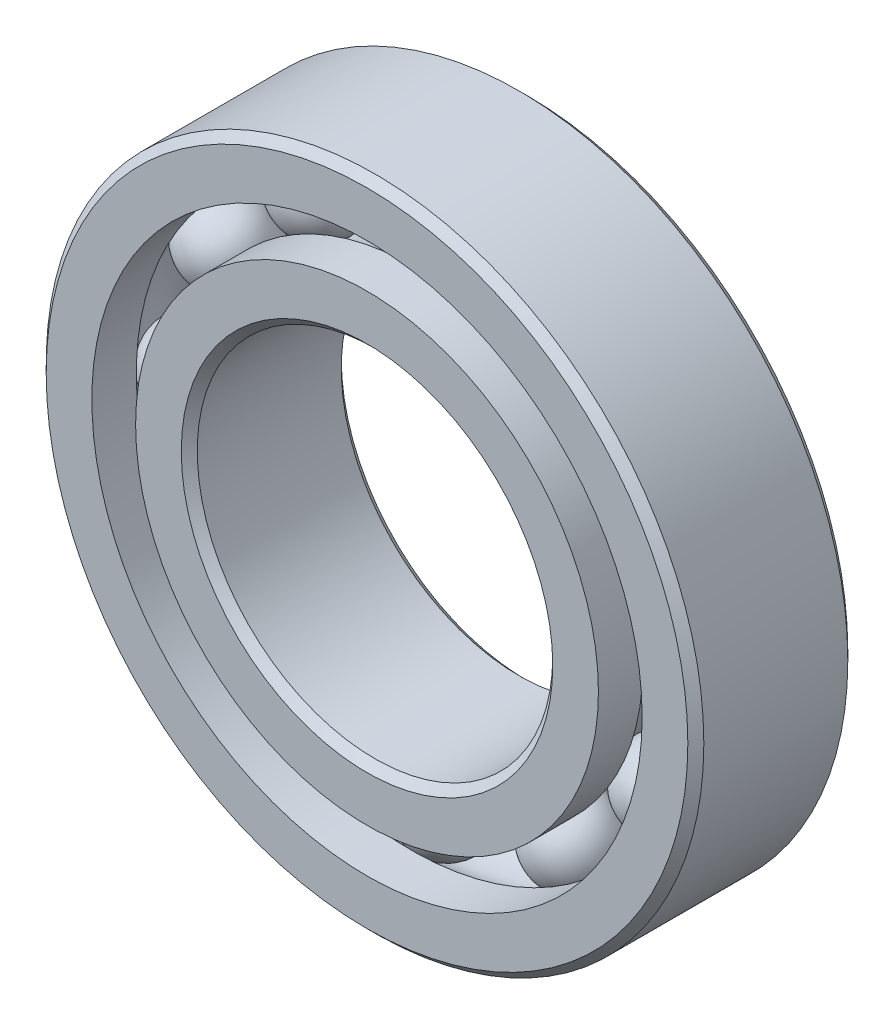
ISO-10303-21;
HEADER;
FILE_DESCRIPTION(('STEP AP214'),'2;1');
FILE_NAME('part.step','',(''),(''),'','','');
FILE_SCHEMA(('AUTOMOTIVE_DESIGN { 1 0 10303 214 1 1 1 1 }'));
ENDSEC;
DATA;
#1=APPLICATION_CONTEXT('core data for automotive mechanical design processes');
#2=APPLICATION_PROTOCOL_DEFINITION('international standard','automotive_design',2000,#1);
#3=PRODUCT_CONTEXT('',#1,'mechanical');
#4=PRODUCT('Part','Part','',(#3));
#5=PRODUCT_RELATED_PRODUCT_CATEGORY('part','',(#4));
#6=PRODUCT_DEFINITION_FORMATION('','',#4);
#7=PRODUCT_DEFINITION_CONTEXT('part definition',#1,'design');
#8=PRODUCT_DEFINITION('design','',#6,#7);
#9=PRODUCT_DEFINITION_SHAPE('','',#8);
#10=(LENGTH_UNIT() NAMED_UNIT(*) SI_UNIT(.MILLI.,.METRE.));
#11=(NAMED_UNIT(*) PLANE_ANGLE_UNIT() SI_UNIT($,.RADIAN.));
#12=(NAMED_UNIT(*) SI_UNIT($,.STERADIAN.) SOLID_ANGLE_UNIT());
#13=UNCERTAINTY_MEASURE_WITH_UNIT(LENGTH_MEASURE(1.E-05),#10,'distance_accuracy_value','');
#14=(GEOMETRIC_REPRESENTATION_CONTEXT(3) GLOBAL_UNCERTAINTY_ASSIGNED_CONTEXT((#13)) GLOBAL_UNIT_ASSIGNED_CONTEXT((#10,
#11,#12)) REPRESENTATION_CONTEXT('',''));
#15=CARTESIAN_POINT('',(0.,0.,0.));
#16=DIRECTION('',(0.,0.,1.));
#17=DIRECTION('',(1.,0.,0.));
#18=AXIS2_PLACEMENT_3D('',#15,#16,#17);
#19=CARTESIAN_POINT('',(-7.12499999999984,12.3408620039283,0.));
#20=DIRECTION('',(0.,0.,1.));
#21=DIRECTION('',(-0.499999999999989,0.866025403784445,0.));
#22=AXIS2_PLACEMENT_3D('',#19,#20,#21);
#23=SPHERICAL_SURFACE('',#22,2.34835961884211);
#24=CARTESIAN_POINT('',(-7.12499999999984,12.3408620039283,2.34835961884211));
#25=VERTEX_POINT('',#24);
#26=VERTEX_LOOP('',#25);
#27=FACE_BOUND('',#26,.T.);
#28=ADVANCED_FACE('F37',(#27),#23,.T.);
#29=CLOSED_SHELL('',(#28));
#30=MANIFOLD_SOLID_BREP('B2',#29);
#31=CARTESIAN_POINT('',(-12.3408620039282,7.12500000000014,0.));
#32=DIRECTION('',(0.,0.,1.));
#33=DIRECTION('',(-0.866025403784433,0.50000000000001,0.));
#34=AXIS2_PLACEMENT_3D('',#31,#32,#33);
#35=SPHERICAL_SURFACE('',#34,2.34835961884211);
#36=CARTESIAN_POINT('',(-12.3408620039282,7.12500000000014,2.34835961884211));
#37=VERTEX_POINT('',#36);
#38=VERTEX_LOOP('',#37);
#39=FACE_BOUND('',#38,.T.);
#40=ADVANCED_FACE('F57',(#39),#35,.T.);
#41=CLOSED_SHELL('',(#40));
#42=MANIFOLD_SOLID_BREP('B6',#41);
#43=CARTESIAN_POINT('',(-14.25,1.49260827235544E-13,0.));
#44=DIRECTION('',(0.,0.,1.));
#45=DIRECTION('',(-1.,0.,0.));
#46=AXIS2_PLACEMENT_3D('',#43,#44,#45);
#47=SPHERICAL_SURFACE('',#46,2.34835961884211);
#48=CARTESIAN_POINT('',(-14.25,1.49260827235544E-13,2.34835961884211));
#49=VERTEX_POINT('',#48);
#50=VERTEX_LOOP('',#49);
#51=FACE_BOUND('',#50,.T.);
#52=ADVANCED_FACE('F77',(#51),#47,.T.);
#53=CLOSED_SHELL('',(#52));
#54=MANIFOLD_SOLID_BREP('B33',#53);
#55=CARTESIAN_POINT('',(-12.3408620039283,-7.12499999999988,0.));
#56=DIRECTION('',(0.,0.,1.));
#57=DIRECTION('',(-0.866025403784443,-0.499999999999992,0.));
#58=AXIS2_PLACEMENT_3D('',#55,#56,#57);
#59=SPHERICAL_SURFACE('',#58,2.34835961884211);
#60=CARTESIAN_POINT('',(-12.3408620039283,-7.12499999999988,2.34835961884211));
#61=VERTEX_POINT('',#60);
#62=VERTEX_LOOP('',#61);
#63=FACE_BOUND('',#62,.T.);
#64=ADVANCED_FACE('F97',(#63),#59,.T.);
#65=CLOSED_SHELL('',(#64));
#66=MANIFOLD_SOLID_BREP('B53',#65);
#67=CARTESIAN_POINT('',(-7.1250000000001,-12.3408620039282,0.));
#68=DIRECTION('',(0.,0.,1.));
#69=DIRECTION('',(-0.500000000000007,-0.866025403784435,0.));
#70=AXIS2_PLACEMENT_3D('',#67,#68,#69);
#71=SPHERICAL_SURFACE('',#70,2.34835961884211);
#72=CARTESIAN_POINT('',(-7.1250000000001,-12.3408620039282,2.34835961884211));
#73=VERTEX_POINT('',#72);
#74=VERTEX_LOOP('',#73);
#75=FACE_BOUND('',#74,.T.);
#76=ADVANCED_FACE('F117',(#75),#71,.T.);
#77=CLOSED_SHELL('',(#76));
#78=MANIFOLD_SOLID_BREP('B73',#77);
#79=CARTESIAN_POINT('',(0.,-14.25,0.));
#80=DIRECTION('',(0.,0.,1.));
#81=DIRECTION('',(0.,-1.,0.));
#82=AXIS2_PLACEMENT_3D('',#79,#80,#81);
#83=SPHERICAL_SURFACE('',#82,2.34835961884211);
#84=CARTESIAN_POINT('',(0.,-14.25,2.34835961884211));
#85=VERTEX_POINT('',#84);
#86=VERTEX_LOOP('',#85);
#87=FACE_BOUND('',#86,.T.);
#88=ADVANCED_FACE('F137',(#87),#83,.T.);
#89=CLOSED_SHELL('',(#88));
#90=MANIFOLD_SOLID_BREP('B93',#89);
#91=CARTESIAN_POINT('',(7.12499999999993,-12.3408620039283,0.));
#92=DIRECTION('',(0.,0.,1.));
#93=DIRECTION('',(0.499999999999995,-0.866025403784442,0.));
#94=AXIS2_PLACEMENT_3D('',#91,#92,#93);
#95=SPHERICAL_SURFACE('',#94,2.34835961884211);
#96=CARTESIAN_POINT('',(7.12499999999993,-12.3408620039283,2.34835961884211));
#97=VERTEX_POINT('',#96);
#98=VERTEX_LOOP('',#97);
#99=FACE_BOUND('',#98,.T.);
#100=ADVANCED_FACE('F157',(#99),#95,.T.);
#101=CLOSED_SHELL('',(#100));
#102=MANIFOLD_SOLID_BREP('B113',#101);
#103=CARTESIAN_POINT('',(12.3408620039282,-7.12500000000006,0.));
#104=DIRECTION('',(0.,0.,1.));
#105=DIRECTION('',(0.866025403784436,-0.500000000000004,0.));
#106=AXIS2_PLACEMENT_3D('',#103,#104,#105);
#107=SPHERICAL_SURFACE('',#106,2.34835961884211);
#108=CARTESIAN_POINT('',(12.3408620039282,-7.12500000000006,2.34835961884211));
#109=VERTEX_POINT('',#108);
#110=VERTEX_LOOP('',#109);
#111=FACE_BOUND('',#110,.T.);
#112=ADVANCED_FACE('F177',(#111),#107,.T.);
#113=CLOSED_SHELL('',(#112));
#114=MANIFOLD_SOLID_BREP('B133',#113);
#115=CARTESIAN_POINT('',(14.25,0.,0.));
#116=DIRECTION('',(0.,0.,1.));
#117=DIRECTION('',(1.,0.,0.));
#118=AXIS2_PLACEMENT_3D('',#115,#116,#117);
#119=SPHERICAL_SURFACE('',#118,2.34835961884211);
#120=CARTESIAN_POINT('',(14.25,0.,2.34835961884211));
#121=VERTEX_POINT('',#120);
#122=VERTEX_LOOP('',#121);
#123=FACE_BOUND('',#122,.T.);
#124=ADVANCED_FACE('F197',(#123),#119,.T.);
#125=CLOSED_SHELL('',(#124));
#126=MANIFOLD_SOLID_BREP('B153',#125);
#127=CARTESIAN_POINT('',(12.3408620039283,7.12499999999997,0.));
#128=DIRECTION('',(0.,0.,1.));
#129=DIRECTION('',(0.86602540378444,0.499999999999998,0.));
#130=AXIS2_PLACEMENT_3D('',#127,#128,#129);
#131=SPHERICAL_SURFACE('',#130,2.34835961884211);
#132=CARTESIAN_POINT('',(12.3408620039283,7.12499999999997,2.34835961884211));
#133=VERTEX_POINT('',#132);
#134=VERTEX_LOOP('',#133);
#135=FACE_BOUND('',#134,.T.);
#136=ADVANCED_FACE('F217',(#135),#131,.T.);
#137=CLOSED_SHELL('',(#136));
#138=MANIFOLD_SOLID_BREP('B173',#137);
#139=CARTESIAN_POINT('',(7.12500000000001,12.3408620039282,0.));
#140=DIRECTION('',(0.,0.,1.));
#141=DIRECTION('',(0.500000000000001,0.866025403784438,0.));
#142=AXIS2_PLACEMENT_3D('',#139,#140,#141);
#143=SPHERICAL_SURFACE('',#142,2.34835961884211);
#144=CARTESIAN_POINT('',(7.12500000000001,12.3408620039282,2.34835961884211));
#145=VERTEX_POINT('',#144);
#146=VERTEX_LOOP('',#145);
#147=FACE_BOUND('',#146,.T.);
#148=ADVANCED_FACE('F237',(#147),#143,.T.);
#149=CLOSED_SHELL('',(#148));
#150=MANIFOLD_SOLID_BREP('B193',#149);
#151=CARTESIAN_POINT('',(0.,14.25,0.));
#152=DIRECTION('',(0.,0.,1.));
#153=DIRECTION('',(0.,1.,0.));
#154=AXIS2_PLACEMENT_3D('',#151,#152,#153);
#155=SPHERICAL_SURFACE('',#154,2.34835961884211);
#156=CARTESIAN_POINT('',(0.,14.25,2.34835961884211));
#157=VERTEX_POINT('',#156);
#158=VERTEX_LOOP('',#157);
#159=FACE_BOUND('',#158,.T.);
#160=ADVANCED_FACE('F259',(#159),#155,.T.);
#161=CLOSED_SHELL('',(#160));
#162=MANIFOLD_SOLID_BREP('B213',#161);
#163=CARTESIAN_POINT('',(0.,13.0192307692308,4.5));
#164=DIRECTION('',(0.,0.,-1.));
#165=DIRECTION('',(-1.,0.,0.));
#166=AXIS2_PLACEMENT_3D('',#163,#164,#165);
#167=PLANE('',#166);
#168=CARTESIAN_POINT('',(0.,0.,4.5));
#169=DIRECTION('',(0.,0.,1.));
#170=DIRECTION('',(1.,0.,0.));
#171=AXIS2_PLACEMENT_3D('',#168,#169,#170);
#172=CIRCLE('',#171,10.45);
#173=CARTESIAN_POINT('',(10.45,0.,4.5));
#174=VERTEX_POINT('',#173);
#175=EDGE_CURVE('E306',#174,#174,#172,.T.);
#176=ORIENTED_EDGE('',*,*,#175,.F.);
#177=EDGE_LOOP('',(#176));
#178=FACE_BOUND('',#177,.T.);
#179=CARTESIAN_POINT('',(0.,0.,4.5));
#180=DIRECTION('',(0.,0.,1.));
#181=DIRECTION('',(1.,0.,0.));
#182=AXIS2_PLACEMENT_3D('',#179,#180,#181);
#183=CIRCLE('',#182,13.0192307692308);
#184=CARTESIAN_POINT('',(13.0192307692308,0.,4.5));
#185=VERTEX_POINT('',#184);
#186=EDGE_CURVE('E258',#185,#185,#183,.T.);
#187=ORIENTED_EDGE('',*,*,#186,.T.);
#188=EDGE_LOOP('',(#187));
#189=FACE_BOUND('',#188,.T.);
#190=ADVANCED_FACE('F278',(#178,#189),#167,.F.);
#191=CARTESIAN_POINT('',(0.,0.,4.5));
#192=DIRECTION('',(0.,0.,1.));
#193=DIRECTION('',(1.,0.,0.));
#194=AXIS2_PLACEMENT_3D('',#191,#192,#193);
#195=CYLINDRICAL_SURFACE('',#194,13.0192307692308);
#196=ORIENTED_EDGE('',*,*,#186,.F.);
#197=EDGE_LOOP('',(#196));
#198=FACE_BOUND('',#197,.T.);
#199=CARTESIAN_POINT('',(0.,0.,2.));
#200=DIRECTION('',(0.,0.,1.));
#201=DIRECTION('',(1.,0.,0.));
#202=AXIS2_PLACEMENT_3D('',#199,#200,#201);
#203=CIRCLE('',#202,13.0192307692308);
#204=CARTESIAN_POINT('',(13.0192307692308,0.,2.));
#205=VERTEX_POINT('',#204);
#206=EDGE_CURVE('E284',#205,#205,#203,.T.);
#207=ORIENTED_EDGE('',*,*,#206,.T.);
#208=EDGE_LOOP('',(#207));
#209=FACE_BOUND('',#208,.T.);
#210=ADVANCED_FACE('F313',(#198,#209),#195,.T.);
#211=CARTESIAN_POINT('',(0.,0.,0.));
#212=DIRECTION('',(0.,0.,1.));
#213=DIRECTION('',(1.,0.,0.));
#214=AXIS2_PLACEMENT_3D('',#211,#212,#213);
#215=TOROIDAL_SURFACE('',#214,14.25,2.34835961884211);
#216=ORIENTED_EDGE('',*,*,#206,.F.);
#217=EDGE_LOOP('',(#216));
#218=FACE_BOUND('',#217,.T.);
#219=CARTESIAN_POINT('',(0.,0.,-2.));
#220=DIRECTION('',(0.,0.,1.));
#221=DIRECTION('',(1.,0.,0.));
#222=AXIS2_PLACEMENT_3D('',#219,#220,#221);
#223=CIRCLE('',#222,13.0192307692308);
#224=CARTESIAN_POINT('',(13.0192307692308,0.,-2.));
#225=VERTEX_POINT('',#224);
#226=EDGE_CURVE('E288',#225,#225,#223,.T.);
#227=ORIENTED_EDGE('',*,*,#226,.T.);
#228=EDGE_LOOP('',(#227));
#229=FACE_BOUND('',#228,.T.);
#230=ADVANCED_FACE('F317',(#218,#229),#215,.F.);
#231=CARTESIAN_POINT('',(0.,0.,4.5));
#232=DIRECTION('',(0.,0.,1.));
#233=DIRECTION('',(1.,0.,0.));
#234=AXIS2_PLACEMENT_3D('',#231,#232,#233);
#235=CYLINDRICAL_SURFACE('',#234,13.0192307692308);
#236=ORIENTED_EDGE('',*,*,#226,.F.);
#237=EDGE_LOOP('',(#236));
#238=FACE_BOUND('',#237,.T.);
#239=CARTESIAN_POINT('',(0.,0.,-4.5));
#240=DIRECTION('',(0.,0.,1.));
#241=DIRECTION('',(1.,0.,0.));
#242=AXIS2_PLACEMENT_3D('',#239,#240,#241);
#243=CIRCLE('',#242,13.0192307692308);
#244=CARTESIAN_POINT('',(13.0192307692308,0.,-4.5));
#245=VERTEX_POINT('',#244);
#246=EDGE_CURVE('E292',#245,#245,#243,.T.);
#247=ORIENTED_EDGE('',*,*,#246,.T.);
#248=EDGE_LOOP('',(#247));
#249=FACE_BOUND('',#248,.T.);
#250=ADVANCED_FACE('F322',(#238,#249),#235,.T.);
#251=CARTESIAN_POINT('',(0.,10.45,-4.5));
#252=DIRECTION('',(0.,0.,1.));
#253=DIRECTION('',(1.,0.,0.));
#254=AXIS2_PLACEMENT_3D('',#251,#252,#253);
#255=PLANE('',#254);
#256=ORIENTED_EDGE('',*,*,#246,.F.);
#257=EDGE_LOOP('',(#256));
#258=FACE_BOUND('',#257,.T.);
#259=CARTESIAN_POINT('',(0.,0.,-4.5));
#260=DIRECTION('',(0.,0.,1.));
#261=DIRECTION('',(1.,0.,0.));
#262=AXIS2_PLACEMENT_3D('',#259,#260,#261);
#263=CIRCLE('',#262,10.45);
#264=CARTESIAN_POINT('',(10.45,0.,-4.5));
#265=VERTEX_POINT('',#264);
#266=EDGE_CURVE('E297',#265,#265,#263,.T.);
#267=ORIENTED_EDGE('',*,*,#266,.T.);
#268=EDGE_LOOP('',(#267));
#269=FACE_BOUND('',#268,.T.);
#270=ADVANCED_FACE('F328',(#258,#269),#255,.F.);
#271=CARTESIAN_POINT('',(0.,0.,-4.05));
#272=DIRECTION('',(0.,0.,-1.));
#273=DIRECTION('',(-1.,0.,0.));
#274=AXIS2_PLACEMENT_3D('',#271,#272,#273);
#275=CONICAL_SURFACE('',#274,9.99999999999999,0.785398163397448);
#276=ORIENTED_EDGE('',*,*,#266,.F.);
#277=EDGE_LOOP('',(#276));
#278=FACE_BOUND('',#277,.T.);
#279=CARTESIAN_POINT('',(0.,0.,-4.05));
#280=DIRECTION('',(0.,0.,1.));
#281=DIRECTION('',(1.,0.,0.));
#282=AXIS2_PLACEMENT_3D('',#279,#280,#281);
#283=CIRCLE('',#282,9.99999999999999);
#284=CARTESIAN_POINT('',(9.99999999999999,0.,-4.05));
#285=VERTEX_POINT('',#284);
#286=EDGE_CURVE('E300',#285,#285,#283,.T.);
#287=ORIENTED_EDGE('',*,*,#286,.T.);
#288=EDGE_LOOP('',(#287));
#289=FACE_BOUND('',#288,.T.);
#290=ADVANCED_FACE('F332',(#278,#289),#275,.F.);
#291=CARTESIAN_POINT('',(0.,0.,4.5));
#292=DIRECTION('',(0.,0.,1.));
#293=DIRECTION('',(1.,0.,0.));
#294=AXIS2_PLACEMENT_3D('',#291,#292,#293);
#295=CYLINDRICAL_SURFACE('',#294,9.99999999999999);
#296=ORIENTED_EDGE('',*,*,#286,.F.);
#297=EDGE_LOOP('',(#296));
#298=FACE_BOUND('',#297,.T.);
#299=CARTESIAN_POINT('',(0.,0.,4.05));
#300=DIRECTION('',(0.,0.,1.));
#301=DIRECTION('',(1.,0.,0.));
#302=AXIS2_PLACEMENT_3D('',#299,#300,#301);
#303=CIRCLE('',#302,9.99999999999999);
#304=CARTESIAN_POINT('',(9.99999999999999,0.,4.05));
#305=VERTEX_POINT('',#304);
#306=EDGE_CURVE('E303',#305,#305,#303,.T.);
#307=ORIENTED_EDGE('',*,*,#306,.T.);
#308=EDGE_LOOP('',(#307));
#309=FACE_BOUND('',#308,.T.);
#310=ADVANCED_FACE('F336',(#298,#309),#295,.F.);
#311=CARTESIAN_POINT('',(0.,0.,4.5));
#312=DIRECTION('',(0.,0.,1.));
#313=DIRECTION('',(1.,0.,0.));
#314=AXIS2_PLACEMENT_3D('',#311,#312,#313);
#315=CONICAL_SURFACE('',#314,10.45,0.785398163397447);
#316=ORIENTED_EDGE('',*,*,#306,.F.);
#317=EDGE_LOOP('',(#316));
#318=FACE_BOUND('',#317,.T.);
#319=ORIENTED_EDGE('',*,*,#175,.T.);
#320=EDGE_LOOP('',(#319));
#321=FACE_BOUND('',#320,.T.);
#322=ADVANCED_FACE('F310',(#318,#321),#315,.F.);
#323=CLOSED_SHELL('',(#190,#210,#230,#250,#270,#290,#310,#322));
#324=MANIFOLD_SOLID_BREP('B233',#323);
#325=CARTESIAN_POINT('',(0.,0.,4.05));
#326=DIRECTION('',(0.,0.,-1.));
#327=DIRECTION('',(-1.,0.,0.));
#328=AXIS2_PLACEMENT_3D('',#325,#326,#327);
#329=CONICAL_SURFACE('',#328,18.5,0.785398163397447);
#330=CARTESIAN_POINT('',(0.,0.,4.5));
#331=DIRECTION('',(0.,0.,1.));
#332=DIRECTION('',(1.,0.,0.));
#333=AXIS2_PLACEMENT_3D('',#330,#331,#332);
#334=CIRCLE('',#333,18.05);
#335=CARTESIAN_POINT('',(18.05,0.,4.5));
#336=VERTEX_POINT('',#335);
#337=EDGE_CURVE('E427',#336,#336,#334,.T.);
#338=ORIENTED_EDGE('',*,*,#337,.F.);
#339=EDGE_LOOP('',(#338));
#340=FACE_BOUND('',#339,.T.);
#341=CARTESIAN_POINT('',(0.,0.,4.05));
#342=DIRECTION('',(0.,0.,1.));
#343=DIRECTION('',(1.,0.,0.));
#344=AXIS2_PLACEMENT_3D('',#341,#342,#343);
#345=CIRCLE('',#344,18.5);
#346=CARTESIAN_POINT('',(18.5,0.,4.05));
#347=VERTEX_POINT('',#346);
#348=EDGE_CURVE('E277',#347,#347,#345,.T.);
#349=ORIENTED_EDGE('',*,*,#348,.T.);
#350=EDGE_LOOP('',(#349));
#351=FACE_BOUND('',#350,.T.);
#352=ADVANCED_FACE('F399',(#340,#351),#329,.T.);
#353=CARTESIAN_POINT('',(0.,0.,4.5));
#354=DIRECTION('',(0.,0.,1.));
#355=DIRECTION('',(1.,0.,0.));
#356=AXIS2_PLACEMENT_3D('',#353,#354,#355);
#357=CYLINDRICAL_SURFACE('',#356,18.5);
#358=ORIENTED_EDGE('',*,*,#348,.F.);
#359=EDGE_LOOP('',(#358));
#360=FACE_BOUND('',#359,.T.);
#361=CARTESIAN_POINT('',(0.,0.,-4.05));
#362=DIRECTION('',(0.,0.,1.));
#363=DIRECTION('',(1.,0.,0.));
#364=AXIS2_PLACEMENT_3D('',#361,#362,#363);
#365=CIRCLE('',#364,18.5);
#366=CARTESIAN_POINT('',(18.5,0.,-4.05));
#367=VERTEX_POINT('',#366);
#368=EDGE_CURVE('E405',#367,#367,#365,.T.);
#369=ORIENTED_EDGE('',*,*,#368,.T.);
#370=EDGE_LOOP('',(#369));
#371=FACE_BOUND('',#370,.T.);
#372=ADVANCED_FACE('F434',(#360,#371),#357,.T.);
#373=CARTESIAN_POINT('',(0.,0.,-4.5));
#374=DIRECTION('',(0.,0.,1.));
#375=DIRECTION('',(1.,0.,0.));
#376=AXIS2_PLACEMENT_3D('',#373,#374,#375);
#377=CONICAL_SURFACE('',#376,18.05,0.785398163397448);
#378=ORIENTED_EDGE('',*,*,#368,.F.);
#379=EDGE_LOOP('',(#378));
#380=FACE_BOUND('',#379,.T.);
#381=CARTESIAN_POINT('',(0.,0.,-4.5));
#382=DIRECTION('',(0.,0.,1.));
#383=DIRECTION('',(1.,0.,0.));
#384=AXIS2_PLACEMENT_3D('',#381,#382,#383);
#385=CIRCLE('',#384,18.05);
#386=CARTESIAN_POINT('',(18.05,0.,-4.5));
#387=VERTEX_POINT('',#386);
#388=EDGE_CURVE('E409',#387,#387,#385,.T.);
#389=ORIENTED_EDGE('',*,*,#388,.T.);
#390=EDGE_LOOP('',(#389));
#391=FACE_BOUND('',#390,.T.);
#392=ADVANCED_FACE('F438',(#380,#391),#377,.T.);
#393=CARTESIAN_POINT('',(0.,18.05,-4.5));
#394=DIRECTION('',(0.,0.,1.));
#395=DIRECTION('',(1.,0.,0.));
#396=AXIS2_PLACEMENT_3D('',#393,#394,#395);
#397=PLANE('',#396);
#398=ORIENTED_EDGE('',*,*,#388,.F.);
#399=EDGE_LOOP('',(#398));
#400=FACE_BOUND('',#399,.T.);
#401=CARTESIAN_POINT('',(0.,0.,-4.5));
#402=DIRECTION('',(0.,0.,1.));
#403=DIRECTION('',(1.,0.,0.));
#404=AXIS2_PLACEMENT_3D('',#401,#402,#403);
#405=CIRCLE('',#404,15.4807692307692);
#406=CARTESIAN_POINT('',(15.4807692307692,0.,-4.5));
#407=VERTEX_POINT('',#406);
#408=EDGE_CURVE('E413',#407,#407,#405,.T.);
#409=ORIENTED_EDGE('',*,*,#408,.T.);
#410=EDGE_LOOP('',(#409));
#411=FACE_BOUND('',#410,.T.);
#412=ADVANCED_FACE('F443',(#400,#411),#397,.F.);
#413=CARTESIAN_POINT('',(0.,0.,4.5));
#414=DIRECTION('',(0.,0.,1.));
#415=DIRECTION('',(1.,0.,0.));
#416=AXIS2_PLACEMENT_3D('',#413,#414,#415);
#417=CYLINDRICAL_SURFACE('',#416,15.4807692307692);
#418=ORIENTED_EDGE('',*,*,#408,.F.);
#419=EDGE_LOOP('',(#418));
#420=FACE_BOUND('',#419,.T.);
#421=CARTESIAN_POINT('',(0.,0.,-2.));
#422=DIRECTION('',(0.,0.,1.));
#423=DIRECTION('',(1.,0.,0.));
#424=AXIS2_PLACEMENT_3D('',#421,#422,#423);
#425=CIRCLE('',#424,15.4807692307692);
#426=CARTESIAN_POINT('',(15.4807692307692,0.,-2.));
#427=VERTEX_POINT('',#426);
#428=EDGE_CURVE('E418',#427,#427,#425,.T.);
#429=ORIENTED_EDGE('',*,*,#428,.T.);
#430=EDGE_LOOP('',(#429));
#431=FACE_BOUND('',#430,.T.);
#432=ADVANCED_FACE('F449',(#420,#431),#417,.F.);
#433=CARTESIAN_POINT('',(0.,0.,0.));
#434=DIRECTION('',(0.,0.,1.));
#435=DIRECTION('',(1.,0.,0.));
#436=AXIS2_PLACEMENT_3D('',#433,#434,#435);
#437=TOROIDAL_SURFACE('',#436,14.25,2.34835961884211);
#438=ORIENTED_EDGE('',*,*,#428,.F.);
#439=EDGE_LOOP('',(#438));
#440=FACE_BOUND('',#439,.T.);
#441=CARTESIAN_POINT('',(0.,0.,2.));
#442=DIRECTION('',(0.,0.,1.));
#443=DIRECTION('',(1.,0.,0.));
#444=AXIS2_PLACEMENT_3D('',#441,#442,#443);
#445=CIRCLE('',#444,15.4807692307692);
#446=CARTESIAN_POINT('',(15.4807692307692,0.,2.));
#447=VERTEX_POINT('',#446);
#448=EDGE_CURVE('E421',#447,#447,#445,.T.);
#449=ORIENTED_EDGE('',*,*,#448,.T.);
#450=EDGE_LOOP('',(#449));
#451=FACE_BOUND('',#450,.T.);
#452=ADVANCED_FACE('F453',(#440,#451),#437,.F.);
#453=CARTESIAN_POINT('',(0.,0.,4.5));
#454=DIRECTION('',(0.,0.,1.));
#455=DIRECTION('',(1.,0.,0.));
#456=AXIS2_PLACEMENT_3D('',#453,#454,#455);
#457=CYLINDRICAL_SURFACE('',#456,15.4807692307692);
#458=ORIENTED_EDGE('',*,*,#448,.F.);
#459=EDGE_LOOP('',(#458));
#460=FACE_BOUND('',#459,.T.);
#461=CARTESIAN_POINT('',(0.,0.,4.5));
#462=DIRECTION('',(0.,0.,1.));
#463=DIRECTION('',(1.,0.,0.));
#464=AXIS2_PLACEMENT_3D('',#461,#462,#463);
#465=CIRCLE('',#464,15.4807692307692);
#466=CARTESIAN_POINT('',(15.4807692307692,0.,4.5));
#467=VERTEX_POINT('',#466);
#468=EDGE_CURVE('E424',#467,#467,#465,.T.);
#469=ORIENTED_EDGE('',*,*,#468,.T.);
#470=EDGE_LOOP('',(#469));
#471=FACE_BOUND('',#470,.T.);
#472=ADVANCED_FACE('F457',(#460,#471),#457,.F.);
#473=CARTESIAN_POINT('',(0.,18.05,4.5));
#474=DIRECTION('',(0.,0.,-1.));
#475=DIRECTION('',(-1.,0.,0.));
#476=AXIS2_PLACEMENT_3D('',#473,#474,#475);
#477=PLANE('',#476);
#478=ORIENTED_EDGE('',*,*,#468,.F.);
#479=EDGE_LOOP('',(#478));
#480=FACE_BOUND('',#479,.T.);
#481=ORIENTED_EDGE('',*,*,#337,.T.);
#482=EDGE_LOOP('',(#481));
#483=FACE_BOUND('',#482,.T.);
#484=ADVANCED_FACE('F431',(#480,#483),#477,.F.);
#485=CLOSED_SHELL('',(#352,#372,#392,#412,#432,#452,#472,#484));
#486=MANIFOLD_SOLID_BREP('B253',#485);
#487=ADVANCED_BREP_SHAPE_REPRESENTATION('',(#18,#30,#42,#54,#66,#78,#90,#102,#114,#126,#138,
#150,#162,#324,#486),#14);
#488=SHAPE_DEFINITION_REPRESENTATION(#9,#487);
ENDSEC;
END-ISO-10303-21;
